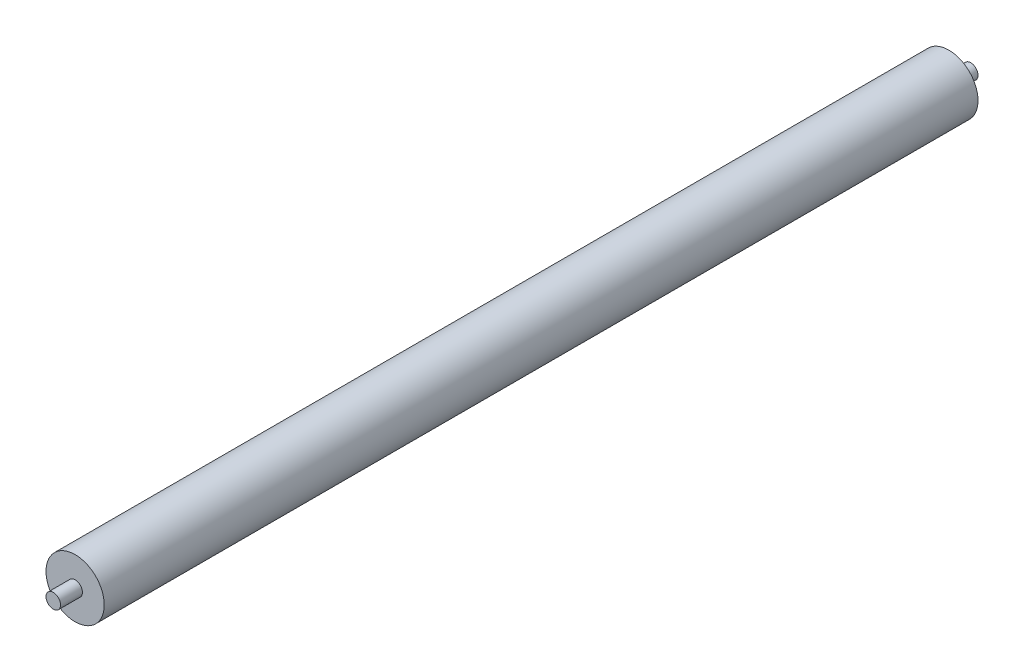
ISO-10303-21;
HEADER;
FILE_DESCRIPTION(('STEP AP214'),'2;1');
FILE_NAME('part.step','',(''),(''),'','','');
FILE_SCHEMA(('AUTOMOTIVE_DESIGN { 1 0 10303 214 1 1 1 1 }'));
ENDSEC;
DATA;
#1=APPLICATION_CONTEXT('core data for automotive mechanical design processes');
#2=APPLICATION_PROTOCOL_DEFINITION('international standard','automotive_design',2000,#1);
#3=PRODUCT_CONTEXT('',#1,'mechanical');
#4=PRODUCT('Part','Part','',(#3));
#5=PRODUCT_RELATED_PRODUCT_CATEGORY('part','',(#4));
#6=PRODUCT_DEFINITION_FORMATION('','',#4);
#7=PRODUCT_DEFINITION_CONTEXT('part definition',#1,'design');
#8=PRODUCT_DEFINITION('design','',#6,#7);
#9=PRODUCT_DEFINITION_SHAPE('','',#8);
#10=(LENGTH_UNIT() NAMED_UNIT(*) SI_UNIT(.MILLI.,.METRE.));
#11=(NAMED_UNIT(*) PLANE_ANGLE_UNIT() SI_UNIT($,.RADIAN.));
#12=(NAMED_UNIT(*) SI_UNIT($,.STERADIAN.) SOLID_ANGLE_UNIT());
#13=UNCERTAINTY_MEASURE_WITH_UNIT(LENGTH_MEASURE(1.E-05),#10,'distance_accuracy_value','');
#14=(GEOMETRIC_REPRESENTATION_CONTEXT(3) GLOBAL_UNCERTAINTY_ASSIGNED_CONTEXT((#13)) GLOBAL_UNIT_ASSIGNED_CONTEXT((#10,
#11,#12)) REPRESENTATION_CONTEXT('',''));
#15=CARTESIAN_POINT('',(0.,0.,0.));
#16=DIRECTION('',(0.,0.,1.));
#17=DIRECTION('',(1.,0.,0.));
#18=AXIS2_PLACEMENT_3D('',#15,#16,#17);
#19=CARTESIAN_POINT('',(0.,0.,400.05));
#20=DIRECTION('',(0.,0.,-1.));
#21=DIRECTION('',(-1.,0.,0.));
#22=AXIS2_PLACEMENT_3D('',#19,#20,#21);
#23=CYLINDRICAL_SURFACE('',#22,6.35);
#24=CARTESIAN_POINT('',(0.,0.,381.));
#25=DIRECTION('',(0.,0.,1.));
#26=DIRECTION('',(1.,0.,0.));
#27=AXIS2_PLACEMENT_3D('',#24,#25,#26);
#28=CIRCLE('',#27,6.35);
#29=CARTESIAN_POINT('',(-6.35,0.,381.));
#30=VERTEX_POINT('',#29);
#31=EDGE_CURVE('E61',#30,#30,#28,.T.);
#32=CARTESIAN_POINT('',(0.,0.,400.05));
#33=DIRECTION('',(0.,0.,1.));
#34=DIRECTION('',(1.,0.,0.));
#35=AXIS2_PLACEMENT_3D('',#32,#33,#34);
#36=CIRCLE('',#35,6.35);
#37=CARTESIAN_POINT('',(-6.35,0.,400.05));
#38=VERTEX_POINT('',#37);
#39=EDGE_CURVE('E47',#38,#38,#36,.T.);
#40=CARTESIAN_POINT('',(-6.35,0.,381.));
#41=CARTESIAN_POINT('',(-6.35,0.,381.1984375));
#42=CARTESIAN_POINT('',(-6.35,0.,381.396875));
#43=CARTESIAN_POINT('',(-6.35,0.,381.79375));
#44=CARTESIAN_POINT('',(-6.35,0.,381.9921875));
#45=CARTESIAN_POINT('',(-6.35,0.,382.3890625));
#46=CARTESIAN_POINT('',(-6.35,0.,382.5875));
#47=CARTESIAN_POINT('',(-6.35,0.,382.984375));
#48=CARTESIAN_POINT('',(-6.35,0.,383.1828125));
#49=CARTESIAN_POINT('',(-6.35,0.,383.5796875));
#50=CARTESIAN_POINT('',(-6.35,0.,383.778125));
#51=CARTESIAN_POINT('',(-6.35,0.,384.175));
#52=CARTESIAN_POINT('',(-6.35,0.,384.3734375));
#53=CARTESIAN_POINT('',(-6.35,0.,384.7703125));
#54=CARTESIAN_POINT('',(-6.35,0.,384.96875));
#55=CARTESIAN_POINT('',(-6.35,0.,385.365625));
#56=CARTESIAN_POINT('',(-6.35,0.,385.5640625));
#57=CARTESIAN_POINT('',(-6.35,0.,385.9609375));
#58=CARTESIAN_POINT('',(-6.35,0.,386.159375));
#59=CARTESIAN_POINT('',(-6.35,0.,386.55625));
#60=CARTESIAN_POINT('',(-6.35,0.,386.7546875));
#61=CARTESIAN_POINT('',(-6.35,0.,387.1515625));
#62=CARTESIAN_POINT('',(-6.35,0.,387.35));
#63=CARTESIAN_POINT('',(-6.35,0.,387.746875));
#64=CARTESIAN_POINT('',(-6.35,0.,387.9453125));
#65=CARTESIAN_POINT('',(-6.35,0.,388.3421875));
#66=CARTESIAN_POINT('',(-6.35,0.,388.540625));
#67=CARTESIAN_POINT('',(-6.35,0.,388.9375));
#68=CARTESIAN_POINT('',(-6.35,0.,389.1359375));
#69=CARTESIAN_POINT('',(-6.35,0.,389.5328125));
#70=CARTESIAN_POINT('',(-6.35,0.,389.73125));
#71=CARTESIAN_POINT('',(-6.35,0.,390.128125));
#72=CARTESIAN_POINT('',(-6.35,0.,390.3265625));
#73=CARTESIAN_POINT('',(-6.35,0.,390.7234375));
#74=CARTESIAN_POINT('',(-6.35,0.,390.921875));
#75=CARTESIAN_POINT('',(-6.35,0.,391.31875));
#76=CARTESIAN_POINT('',(-6.35,0.,391.5171875));
#77=CARTESIAN_POINT('',(-6.35,0.,391.9140625));
#78=CARTESIAN_POINT('',(-6.35,0.,392.1125));
#79=CARTESIAN_POINT('',(-6.35,0.,392.509375));
#80=CARTESIAN_POINT('',(-6.35,0.,392.7078125));
#81=CARTESIAN_POINT('',(-6.35,0.,393.1046875));
#82=CARTESIAN_POINT('',(-6.35,0.,393.303125));
#83=CARTESIAN_POINT('',(-6.35,0.,393.7));
#84=CARTESIAN_POINT('',(-6.35,0.,393.8984375));
#85=CARTESIAN_POINT('',(-6.35,0.,394.2953125));
#86=CARTESIAN_POINT('',(-6.35,0.,394.49375));
#87=CARTESIAN_POINT('',(-6.35,0.,394.890625));
#88=CARTESIAN_POINT('',(-6.35,0.,395.0890625));
#89=CARTESIAN_POINT('',(-6.35,0.,395.4859375));
#90=CARTESIAN_POINT('',(-6.35,0.,395.684375));
#91=CARTESIAN_POINT('',(-6.35,0.,396.08125));
#92=CARTESIAN_POINT('',(-6.35,0.,396.2796875));
#93=CARTESIAN_POINT('',(-6.35,0.,396.6765625));
#94=CARTESIAN_POINT('',(-6.35,0.,396.875));
#95=CARTESIAN_POINT('',(-6.35,0.,397.271875));
#96=CARTESIAN_POINT('',(-6.35,0.,397.4703125));
#97=CARTESIAN_POINT('',(-6.35,0.,397.8671875));
#98=CARTESIAN_POINT('',(-6.35,0.,398.065625));
#99=CARTESIAN_POINT('',(-6.35,0.,398.4625));
#100=CARTESIAN_POINT('',(-6.35,0.,398.6609375));
#101=CARTESIAN_POINT('',(-6.35,0.,399.0578125));
#102=CARTESIAN_POINT('',(-6.35,0.,399.25625));
#103=CARTESIAN_POINT('',(-6.35,0.,399.653125));
#104=CARTESIAN_POINT('',(-6.35,0.,399.8515625));
#105=CARTESIAN_POINT('',(-6.35,0.,400.05));
#106=B_SPLINE_CURVE_WITH_KNOTS('',3,(#40,#41,#42,#43,#44,#45,#46,#47,#48,#49,#50,#51,#52,#53,
#54,#55,#56,#57,#58,#59,#60,#61,#62,#63,#64,#65,#66,#67,#68,#69,#70,#71,#72,#73,#74,#75,#76,#77,
#78,#79,#80,#81,#82,#83,#84,#85,#86,#87,#88,#89,#90,#91,#92,#93,#94,#95,#96,#97,#98,#99,#100,
#101,#102,#103,#104,#105),.UNSPECIFIED.,.F.,.F.,(4,2,2,2,2,2,2,2,2,2,2,2,2,2,2,2,2,2,2,2,2,2,2,
2,2,2,2,2,2,2,2,2,4),(0.,0.5953125,1.190625,1.7859375,2.38125,2.9765625,3.571875,4.1671875,
4.7625,5.3578125,5.953125,6.5484375,7.14375,7.7390625,8.334375,8.92968750000001,
9.52500000000001,10.1203125,10.715625,11.3109375,11.90625,12.5015625,13.096875,13.6921875,
14.2875,14.8828125,15.478125,16.0734375,16.66875,17.2640625,17.859375,18.4546875,19.05),.UNSPECIFIED.);
#107=EDGE_CURVE('BSEAM41',#30,#38,#106,.T.);
#108=ORIENTED_EDGE('',*,*,#31,.T.);
#109=ORIENTED_EDGE('',*,*,#39,.F.);
#110=ORIENTED_EDGE('',*,*,#107,.T.);
#111=ORIENTED_EDGE('',*,*,#107,.F.);
#112=EDGE_LOOP('',(#108,#110,#109,#111));
#113=FACE_BOUND('',#112,.T.);
#114=ADVANCED_FACE('F41',(#113),#23,.T.);
#115=CARTESIAN_POINT('',(0.,0.,400.05));
#116=DIRECTION('',(0.,0.,1.));
#117=DIRECTION('',(1.,0.,0.));
#118=AXIS2_PLACEMENT_3D('',#115,#116,#117);
#119=PLANE('',#118);
#120=ORIENTED_EDGE('',*,*,#39,.T.);
#121=EDGE_LOOP('',(#120));
#122=FACE_BOUND('',#121,.T.);
#123=ADVANCED_FACE('F72',(#122),#119,.T.);
#124=CARTESIAN_POINT('',(0.,0.,381.));
#125=DIRECTION('',(0.,0.,1.));
#126=DIRECTION('',(1.,0.,0.));
#127=AXIS2_PLACEMENT_3D('',#124,#125,#126);
#128=PLANE('',#127);
#129=CARTESIAN_POINT('',(0.,0.,381.));
#130=DIRECTION('',(0.,0.,1.));
#131=DIRECTION('',(1.,0.,0.));
#132=AXIS2_PLACEMENT_3D('',#129,#130,#131);
#133=CIRCLE('',#132,25.4);
#134=CARTESIAN_POINT('',(25.4,0.,381.));
#135=VERTEX_POINT('',#134);
#136=EDGE_CURVE('E56',#135,#135,#133,.T.);
#137=ORIENTED_EDGE('',*,*,#136,.T.);
#138=EDGE_LOOP('',(#137));
#139=FACE_BOUND('',#138,.T.);
#140=ORIENTED_EDGE('',*,*,#31,.F.);
#141=EDGE_LOOP('',(#140));
#142=FACE_BOUND('',#141,.T.);
#143=ADVANCED_FACE('F69',(#139,#142),#128,.T.);
#144=CARTESIAN_POINT('',(0.,0.,-381.));
#145=DIRECTION('',(0.,0.,1.));
#146=DIRECTION('',(1.,0.,0.));
#147=AXIS2_PLACEMENT_3D('',#144,#145,#146);
#148=PLANE('',#147);
#149=CARTESIAN_POINT('',(0.,0.,-381.));
#150=DIRECTION('',(0.,0.,1.));
#151=DIRECTION('',(1.,0.,0.));
#152=AXIS2_PLACEMENT_3D('',#149,#150,#151);
#153=CIRCLE('',#152,25.4);
#154=CARTESIAN_POINT('',(25.4,0.,-381.));
#155=VERTEX_POINT('',#154);
#156=EDGE_CURVE('E58',#155,#155,#153,.T.);
#157=ORIENTED_EDGE('',*,*,#156,.F.);
#158=EDGE_LOOP('',(#157));
#159=FACE_BOUND('',#158,.T.);
#160=CARTESIAN_POINT('',(0.,0.,-381.));
#161=DIRECTION('',(0.,0.,1.));
#162=DIRECTION('',(1.,0.,0.));
#163=AXIS2_PLACEMENT_3D('',#160,#161,#162);
#164=CIRCLE('',#163,6.35);
#165=CARTESIAN_POINT('',(-6.35,0.,-381.));
#166=VERTEX_POINT('',#165);
#167=EDGE_CURVE('E10',#166,#166,#164,.T.);
#168=ORIENTED_EDGE('',*,*,#167,.T.);
#169=EDGE_LOOP('',(#168));
#170=FACE_BOUND('',#169,.T.);
#171=ADVANCED_FACE('F71',(#159,#170),#148,.F.);
#172=CARTESIAN_POINT('',(0.,0.,381.));
#173=DIRECTION('',(0.,0.,-1.));
#174=DIRECTION('',(-1.,0.,0.));
#175=AXIS2_PLACEMENT_3D('',#172,#173,#174);
#176=CYLINDRICAL_SURFACE('',#175,25.4);
#177=ORIENTED_EDGE('',*,*,#136,.F.);
#178=EDGE_LOOP('',(#177));
#179=FACE_BOUND('',#178,.T.);
#180=ORIENTED_EDGE('',*,*,#156,.T.);
#181=EDGE_LOOP('',(#180));
#182=FACE_BOUND('',#181,.T.);
#183=ADVANCED_FACE('F79',(#179,#182),#176,.T.);
#184=CARTESIAN_POINT('',(0.,0.,-400.05));
#185=DIRECTION('',(0.,0.,1.));
#186=DIRECTION('',(1.,0.,0.));
#187=AXIS2_PLACEMENT_3D('',#184,#185,#186);
#188=PLANE('',#187);
#189=CARTESIAN_POINT('',(0.,0.,-400.05));
#190=DIRECTION('',(0.,0.,1.));
#191=DIRECTION('',(1.,0.,0.));
#192=AXIS2_PLACEMENT_3D('',#189,#190,#191);
#193=CIRCLE('',#192,6.35);
#194=CARTESIAN_POINT('',(-6.35,0.,-400.05));
#195=VERTEX_POINT('',#194);
#196=EDGE_CURVE('E51',#195,#195,#193,.T.);
#197=ORIENTED_EDGE('',*,*,#196,.F.);
#198=EDGE_LOOP('',(#197));
#199=FACE_BOUND('',#198,.T.);
#200=ADVANCED_FACE('F88',(#199),#188,.F.);
#201=CARTESIAN_POINT('',(-6.35,0.,-400.05));
#202=CARTESIAN_POINT('',(-6.35,0.,-399.8515625));
#203=CARTESIAN_POINT('',(-6.35,0.,-399.653125));
#204=CARTESIAN_POINT('',(-6.35,0.,-399.25625));
#205=CARTESIAN_POINT('',(-6.35,0.,-399.0578125));
#206=CARTESIAN_POINT('',(-6.35,0.,-398.6609375));
#207=CARTESIAN_POINT('',(-6.35,0.,-398.4625));
#208=CARTESIAN_POINT('',(-6.35,0.,-398.065625));
#209=CARTESIAN_POINT('',(-6.35,0.,-397.8671875));
#210=CARTESIAN_POINT('',(-6.35,0.,-397.4703125));
#211=CARTESIAN_POINT('',(-6.35,0.,-397.271875));
#212=CARTESIAN_POINT('',(-6.35,0.,-396.875));
#213=CARTESIAN_POINT('',(-6.35,0.,-396.6765625));
#214=CARTESIAN_POINT('',(-6.35,0.,-396.2796875));
#215=CARTESIAN_POINT('',(-6.35,0.,-396.08125));
#216=CARTESIAN_POINT('',(-6.35,0.,-395.684375));
#217=CARTESIAN_POINT('',(-6.35,0.,-395.4859375));
#218=CARTESIAN_POINT('',(-6.35,0.,-395.0890625));
#219=CARTESIAN_POINT('',(-6.35,0.,-394.890625));
#220=CARTESIAN_POINT('',(-6.35,0.,-394.49375));
#221=CARTESIAN_POINT('',(-6.35,0.,-394.2953125));
#222=CARTESIAN_POINT('',(-6.35,0.,-393.8984375));
#223=CARTESIAN_POINT('',(-6.35,0.,-393.7));
#224=CARTESIAN_POINT('',(-6.35,0.,-393.303125));
#225=CARTESIAN_POINT('',(-6.35,0.,-393.1046875));
#226=CARTESIAN_POINT('',(-6.35,0.,-392.7078125));
#227=CARTESIAN_POINT('',(-6.35,0.,-392.509375));
#228=CARTESIAN_POINT('',(-6.35,0.,-392.1125));
#229=CARTESIAN_POINT('',(-6.35,0.,-391.9140625));
#230=CARTESIAN_POINT('',(-6.35,0.,-391.5171875));
#231=CARTESIAN_POINT('',(-6.35,0.,-391.31875));
#232=CARTESIAN_POINT('',(-6.35,0.,-390.921875));
#233=CARTESIAN_POINT('',(-6.35,0.,-390.7234375));
#234=CARTESIAN_POINT('',(-6.35,0.,-390.3265625));
#235=CARTESIAN_POINT('',(-6.35,0.,-390.128125));
#236=CARTESIAN_POINT('',(-6.35,0.,-389.73125));
#237=CARTESIAN_POINT('',(-6.35,0.,-389.5328125));
#238=CARTESIAN_POINT('',(-6.35,0.,-389.1359375));
#239=CARTESIAN_POINT('',(-6.35,0.,-388.9375));
#240=CARTESIAN_POINT('',(-6.35,0.,-388.540625));
#241=CARTESIAN_POINT('',(-6.35,0.,-388.3421875));
#242=CARTESIAN_POINT('',(-6.35,0.,-387.9453125));
#243=CARTESIAN_POINT('',(-6.35,0.,-387.746875));
#244=CARTESIAN_POINT('',(-6.35,0.,-387.35));
#245=CARTESIAN_POINT('',(-6.35,0.,-387.1515625));
#246=CARTESIAN_POINT('',(-6.35,0.,-386.7546875));
#247=CARTESIAN_POINT('',(-6.35,0.,-386.55625));
#248=CARTESIAN_POINT('',(-6.35,0.,-386.159375));
#249=CARTESIAN_POINT('',(-6.35,0.,-385.9609375));
#250=CARTESIAN_POINT('',(-6.35,0.,-385.5640625));
#251=CARTESIAN_POINT('',(-6.35,0.,-385.365625));
#252=CARTESIAN_POINT('',(-6.35,0.,-384.96875));
#253=CARTESIAN_POINT('',(-6.35,0.,-384.7703125));
#254=CARTESIAN_POINT('',(-6.35,0.,-384.3734375));
#255=CARTESIAN_POINT('',(-6.35,0.,-384.175));
#256=CARTESIAN_POINT('',(-6.35,0.,-383.778125));
#257=CARTESIAN_POINT('',(-6.35,0.,-383.5796875));
#258=CARTESIAN_POINT('',(-6.35,0.,-383.1828125));
#259=CARTESIAN_POINT('',(-6.35,0.,-382.984375));
#260=CARTESIAN_POINT('',(-6.35,0.,-382.5875));
#261=CARTESIAN_POINT('',(-6.35,0.,-382.3890625));
#262=CARTESIAN_POINT('',(-6.35,0.,-381.9921875));
#263=CARTESIAN_POINT('',(-6.35,0.,-381.79375));
#264=CARTESIAN_POINT('',(-6.35,0.,-381.396875));
#265=CARTESIAN_POINT('',(-6.35,0.,-381.1984375));
#266=CARTESIAN_POINT('',(-6.35,0.,-381.));
#267=B_SPLINE_CURVE_WITH_KNOTS('',3,(#201,#202,#203,#204,#205,#206,#207,#208,#209,#210,#211,
#212,#213,#214,#215,#216,#217,#218,#219,#220,#221,#222,#223,#224,#225,#226,#227,#228,#229,#230,
#231,#232,#233,#234,#235,#236,#237,#238,#239,#240,#241,#242,#243,#244,#245,#246,#247,#248,#249,
#250,#251,#252,#253,#254,#255,#256,#257,#258,#259,#260,#261,#262,#263,#264,#265,#266),
.UNSPECIFIED.,.F.,.F.,(4,2,2,2,2,2,2,2,2,2,2,2,2,2,2,2,2,2,2,2,2,2,2,2,2,2,2,2,2,2,2,2,4),(0.,
0.5953125,1.190625,1.7859375,2.38125,2.9765625,3.571875,4.1671875,4.7625,5.35781249999989,
5.95312499999989,6.54843749999989,7.14374999999989,7.73906249999989,8.33437499999989,
8.92968749999989,9.5249999999999,10.1203124999999,10.7156249999999,11.3109374999999,
11.9062499999999,12.5015624999999,13.0968749999999,13.6921874999999,14.2874999999998,
14.8828124999998,15.4781249999998,16.0734374999998,16.6687499999998,17.2640624999998,
17.8593749999998,18.4546874999998,19.0499999999998),.UNSPECIFIED.);
#268=EDGE_CURVE('BSEAM84',#195,#166,#267,.T.);
#269=ORIENTED_EDGE('',*,*,#196,.T.);
#270=ORIENTED_EDGE('',*,*,#167,.F.);
#271=ORIENTED_EDGE('',*,*,#268,.T.);
#272=ORIENTED_EDGE('',*,*,#268,.F.);
#273=EDGE_LOOP('',(#269,#271,#270,#272));
#274=FACE_BOUND('',#273,.T.);
#275=ADVANCED_FACE('F84',(#274),#23,.T.);
#276=CLOSED_SHELL('',(#114,#123,#143,#171,#183,#200,#275));
#277=MANIFOLD_SOLID_BREP('B2',#276);
#278=ADVANCED_BREP_SHAPE_REPRESENTATION('',(#18,#277),#14);
#279=SHAPE_DEFINITION_REPRESENTATION(#9,#278);
ENDSEC;
END-ISO-10303-21;
